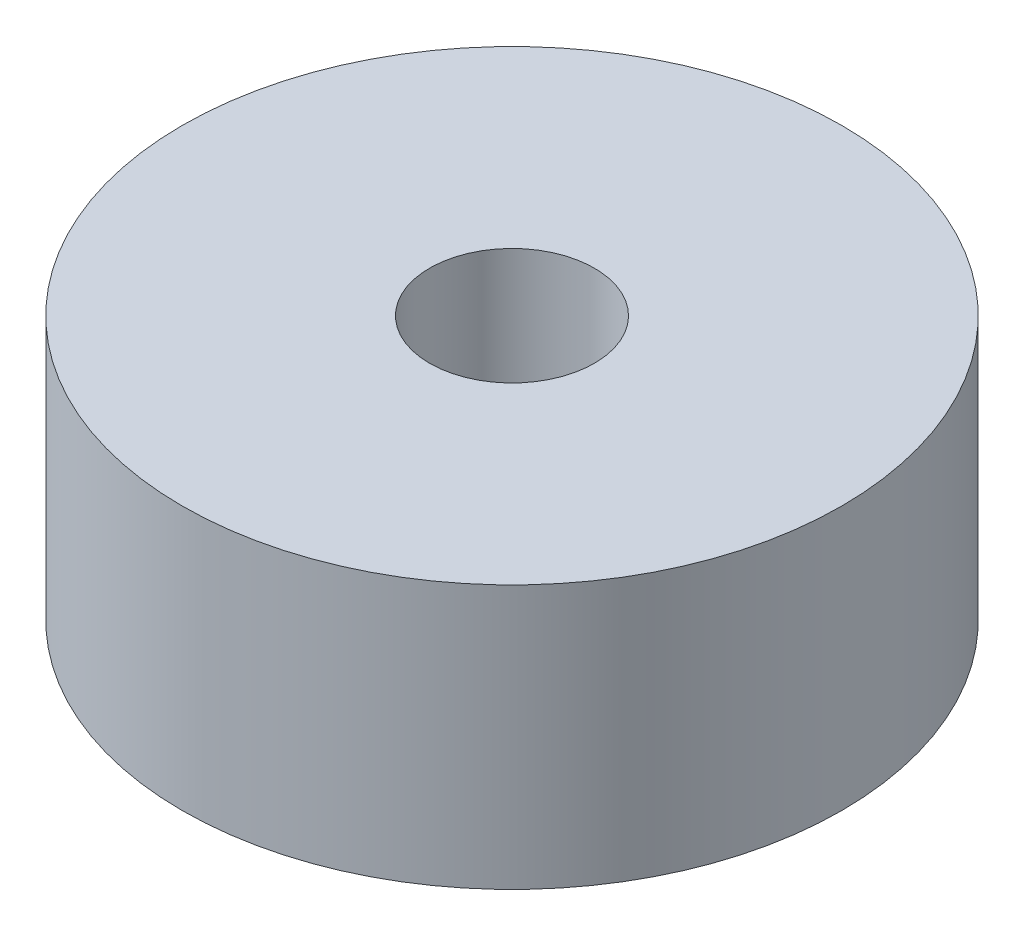
ISO-10303-21;
HEADER;
FILE_DESCRIPTION(('STEP AP214'),'2;1');
FILE_NAME('part.step','',(''),(''),'','','');
FILE_SCHEMA(('AUTOMOTIVE_DESIGN { 1 0 10303 214 1 1 1 1 }'));
ENDSEC;
DATA;
#1=APPLICATION_CONTEXT('core data for automotive mechanical design processes');
#2=APPLICATION_PROTOCOL_DEFINITION('international standard','automotive_design',2000,#1);
#3=PRODUCT_CONTEXT('',#1,'mechanical');
#4=PRODUCT('Part','Part','',(#3));
#5=PRODUCT_RELATED_PRODUCT_CATEGORY('part','',(#4));
#6=PRODUCT_DEFINITION_FORMATION('','',#4);
#7=PRODUCT_DEFINITION_CONTEXT('part definition',#1,'design');
#8=PRODUCT_DEFINITION('design','',#6,#7);
#9=PRODUCT_DEFINITION_SHAPE('','',#8);
#10=(LENGTH_UNIT() NAMED_UNIT(*) SI_UNIT(.MILLI.,.METRE.));
#11=(NAMED_UNIT(*) PLANE_ANGLE_UNIT() SI_UNIT($,.RADIAN.));
#12=(NAMED_UNIT(*) SI_UNIT($,.STERADIAN.) SOLID_ANGLE_UNIT());
#13=UNCERTAINTY_MEASURE_WITH_UNIT(LENGTH_MEASURE(1.E-05),#10,'distance_accuracy_value','');
#14=(GEOMETRIC_REPRESENTATION_CONTEXT(3) GLOBAL_UNCERTAINTY_ASSIGNED_CONTEXT((#13)) GLOBAL_UNIT_ASSIGNED_CONTEXT((#10,
#11,#12)) REPRESENTATION_CONTEXT('',''));
#15=CARTESIAN_POINT('',(0.,0.,0.));
#16=DIRECTION('',(0.,0.,1.));
#17=DIRECTION('',(1.,0.,0.));
#18=AXIS2_PLACEMENT_3D('',#15,#16,#17);
#19=CARTESIAN_POINT('',(0.,80.,0.));
#20=DIRECTION('',(0.,1.,0.));
#21=DIRECTION('',(0.,0.,1.));
#22=AXIS2_PLACEMENT_3D('',#19,#20,#21);
#23=PLANE('',#22);
#24=CARTESIAN_POINT('',(0.,80.,0.));
#25=DIRECTION('',(0.,1.,0.));
#26=DIRECTION('',(0.,0.,1.));
#27=AXIS2_PLACEMENT_3D('',#24,#25,#26);
#28=CIRCLE('',#27,100.);
#29=CARTESIAN_POINT('',(0.,80.,100.));
#30=VERTEX_POINT('',#29);
#31=EDGE_CURVE('E10',#30,#30,#28,.T.);
#32=ORIENTED_EDGE('',*,*,#31,.T.);
#33=EDGE_LOOP('',(#32));
#34=FACE_BOUND('',#33,.T.);
#35=CARTESIAN_POINT('',(0.,80.,0.));
#36=DIRECTION('',(0.,1.,0.));
#37=DIRECTION('',(0.,0.,1.));
#38=AXIS2_PLACEMENT_3D('',#35,#36,#37);
#39=CIRCLE('',#38,25.);
#40=CARTESIAN_POINT('',(0.,80.,25.));
#41=VERTEX_POINT('',#40);
#42=EDGE_CURVE('E44',#41,#41,#39,.T.);
#43=ORIENTED_EDGE('',*,*,#42,.F.);
#44=EDGE_LOOP('',(#43));
#45=FACE_BOUND('',#44,.T.);
#46=ADVANCED_FACE('F33',(#34,#45),#23,.T.);
#47=CARTESIAN_POINT('',(0.,0.,0.));
#48=DIRECTION('',(0.,1.,0.));
#49=DIRECTION('',(0.,0.,1.));
#50=AXIS2_PLACEMENT_3D('',#47,#48,#49);
#51=PLANE('',#50);
#52=CARTESIAN_POINT('',(0.,0.,0.));
#53=DIRECTION('',(0.,1.,0.));
#54=DIRECTION('',(0.,0.,1.));
#55=AXIS2_PLACEMENT_3D('',#52,#53,#54);
#56=CIRCLE('',#55,100.);
#57=CARTESIAN_POINT('',(0.,0.,100.));
#58=VERTEX_POINT('',#57);
#59=EDGE_CURVE('E37',#58,#58,#56,.T.);
#60=ORIENTED_EDGE('',*,*,#59,.F.);
#61=EDGE_LOOP('',(#60));
#62=FACE_BOUND('',#61,.T.);
#63=CARTESIAN_POINT('',(0.,0.,0.));
#64=DIRECTION('',(0.,1.,0.));
#65=DIRECTION('',(0.,0.,1.));
#66=AXIS2_PLACEMENT_3D('',#63,#64,#65);
#67=CIRCLE('',#66,25.);
#68=CARTESIAN_POINT('',(0.,0.,25.));
#69=VERTEX_POINT('',#68);
#70=EDGE_CURVE('E46',#69,#69,#67,.T.);
#71=ORIENTED_EDGE('',*,*,#70,.T.);
#72=EDGE_LOOP('',(#71));
#73=FACE_BOUND('',#72,.T.);
#74=ADVANCED_FACE('F56',(#62,#73),#51,.F.);
#75=CARTESIAN_POINT('',(0.,80.,0.));
#76=DIRECTION('',(0.,-1.,0.));
#77=DIRECTION('',(0.,0.,-1.));
#78=AXIS2_PLACEMENT_3D('',#75,#76,#77);
#79=CYLINDRICAL_SURFACE('',#78,100.);
#80=ORIENTED_EDGE('',*,*,#31,.F.);
#81=EDGE_LOOP('',(#80));
#82=FACE_BOUND('',#81,.T.);
#83=ORIENTED_EDGE('',*,*,#59,.T.);
#84=EDGE_LOOP('',(#83));
#85=FACE_BOUND('',#84,.T.);
#86=ADVANCED_FACE('F35',(#82,#85),#79,.T.);
#87=CARTESIAN_POINT('',(0.,80.,0.));
#88=DIRECTION('',(0.,-1.,0.));
#89=DIRECTION('',(0.,0.,-1.));
#90=AXIS2_PLACEMENT_3D('',#87,#88,#89);
#91=CYLINDRICAL_SURFACE('',#90,25.);
#92=ORIENTED_EDGE('',*,*,#42,.T.);
#93=EDGE_LOOP('',(#92));
#94=FACE_BOUND('',#93,.T.);
#95=ORIENTED_EDGE('',*,*,#70,.F.);
#96=EDGE_LOOP('',(#95));
#97=FACE_BOUND('',#96,.T.);
#98=ADVANCED_FACE('F52',(#94,#97),#91,.F.);
#99=CLOSED_SHELL('',(#46,#74,#86,#98));
#100=MANIFOLD_SOLID_BREP('B2',#99);
#101=ADVANCED_BREP_SHAPE_REPRESENTATION('',(#18,#100),#14);
#102=SHAPE_DEFINITION_REPRESENTATION(#9,#101);
ENDSEC;
END-ISO-10303-21;
